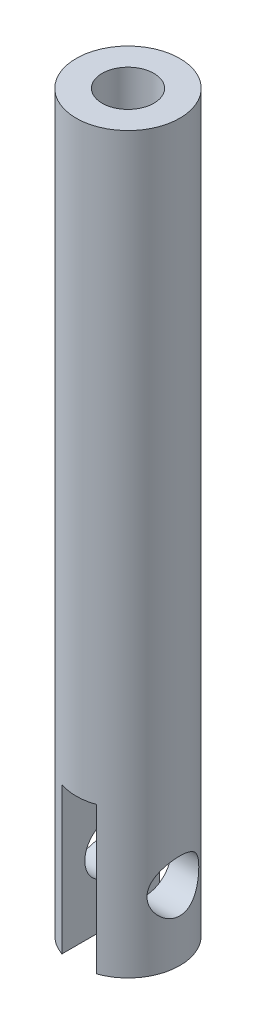
ISO-10303-21;
HEADER;
FILE_DESCRIPTION(('STEP AP214'),'2;1');
FILE_NAME('part.step','',(''),(''),'','','');
FILE_SCHEMA(('AUTOMOTIVE_DESIGN { 1 0 10303 214 1 1 1 1 }'));
ENDSEC;
DATA;
#1=APPLICATION_CONTEXT('core data for automotive mechanical design processes');
#2=APPLICATION_PROTOCOL_DEFINITION('international standard','automotive_design',2000,#1);
#3=PRODUCT_CONTEXT('',#1,'mechanical');
#4=PRODUCT('Part','Part','',(#3));
#5=PRODUCT_RELATED_PRODUCT_CATEGORY('part','',(#4));
#6=PRODUCT_DEFINITION_FORMATION('','',#4);
#7=PRODUCT_DEFINITION_CONTEXT('part definition',#1,'design');
#8=PRODUCT_DEFINITION('design','',#6,#7);
#9=PRODUCT_DEFINITION_SHAPE('','',#8);
#10=(LENGTH_UNIT() NAMED_UNIT(*) SI_UNIT(.MILLI.,.METRE.));
#11=(NAMED_UNIT(*) PLANE_ANGLE_UNIT() SI_UNIT($,.RADIAN.));
#12=(NAMED_UNIT(*) SI_UNIT($,.STERADIAN.) SOLID_ANGLE_UNIT());
#13=UNCERTAINTY_MEASURE_WITH_UNIT(LENGTH_MEASURE(1.E-05),#10,'distance_accuracy_value','');
#14=(GEOMETRIC_REPRESENTATION_CONTEXT(3) GLOBAL_UNCERTAINTY_ASSIGNED_CONTEXT((#13)) GLOBAL_UNIT_ASSIGNED_CONTEXT((#10,
#11,#12)) REPRESENTATION_CONTEXT('',''));
#15=CARTESIAN_POINT('',(0.,0.,0.));
#16=DIRECTION('',(0.,0.,1.));
#17=DIRECTION('',(1.,0.,0.));
#18=AXIS2_PLACEMENT_3D('',#15,#16,#17);
#19=CARTESIAN_POINT('',(0.,75.,0.));
#20=DIRECTION('',(0.,-1.,0.));
#21=DIRECTION('',(0.,0.,-1.));
#22=AXIS2_PLACEMENT_3D('',#19,#20,#21);
#23=CYLINDRICAL_SURFACE('',#22,1.5);
#24=CARTESIAN_POINT('',(0.,7.00000000000001,0.));
#25=DIRECTION('',(0.,-1.,0.));
#26=DIRECTION('',(0.,0.,-1.));
#27=AXIS2_PLACEMENT_3D('',#24,#25,#26);
#28=CIRCLE('',#27,1.5);
#29=CARTESIAN_POINT('',(0.,7.00000000000001,-1.5));
#30=VERTEX_POINT('',#29);
#31=EDGE_CURVE('E180',#30,#30,#28,.T.);
#32=ORIENTED_EDGE('',*,*,#31,.T.);
#33=EDGE_LOOP('',(#32));
#34=FACE_BOUND('',#33,.T.);
#35=CARTESIAN_POINT('',(0.,54.,0.));
#36=DIRECTION('',(0.,-0.707106781186547,0.707106781186548));
#37=DIRECTION('',(0.,-0.707106781186547,-0.707106781186548));
#38=AXIS2_PLACEMENT_3D('',#35,#36,#37);
#39=ELLIPSE('',#38,2.12132034355964,1.5);
#40=CARTESIAN_POINT('',(-1.5,54.,0.));
#41=VERTEX_POINT('',#40);
#42=CARTESIAN_POINT('',(1.5,54.,0.));
#43=VERTEX_POINT('',#42);
#44=EDGE_CURVE('E79',#41,#43,#39,.T.);
#45=ORIENTED_EDGE('',*,*,#44,.F.);
#46=CARTESIAN_POINT('',(0.,54.,0.));
#47=DIRECTION('',(0.,-0.707106781186547,-0.707106781186548));
#48=DIRECTION('',(0.,-0.707106781186547,0.707106781186548));
#49=AXIS2_PLACEMENT_3D('',#46,#47,#48);
#50=ELLIPSE('',#49,2.12132034355964,1.5);
#51=EDGE_CURVE('E177',#43,#41,#50,.F.);
#52=ORIENTED_EDGE('',*,*,#51,.F.);
#53=EDGE_LOOP('',(#45,#52));
#54=FACE_BOUND('',#53,.T.);
#55=CARTESIAN_POINT('',(0.,23.5,0.));
#56=DIRECTION('',(0.,-0.707106781186547,0.707106781186548));
#57=DIRECTION('',(0.,-0.707106781186547,-0.707106781186548));
#58=AXIS2_PLACEMENT_3D('',#55,#56,#57);
#59=ELLIPSE('',#58,2.12132034355964,1.5);
#60=CARTESIAN_POINT('',(-1.5,23.5,0.));
#61=VERTEX_POINT('',#60);
#62=CARTESIAN_POINT('',(1.5,23.5,0.));
#63=VERTEX_POINT('',#62);
#64=EDGE_CURVE('E172',#61,#63,#59,.T.);
#65=ORIENTED_EDGE('',*,*,#64,.F.);
#66=CARTESIAN_POINT('',(0.,23.5,0.));
#67=DIRECTION('',(0.,-0.707106781186547,-0.707106781186548));
#68=DIRECTION('',(0.,-0.707106781186547,0.707106781186548));
#69=AXIS2_PLACEMENT_3D('',#66,#67,#68);
#70=ELLIPSE('',#69,2.12132034355964,1.5);
#71=EDGE_CURVE('E171',#63,#61,#70,.F.);
#72=ORIENTED_EDGE('',*,*,#71,.F.);
#73=EDGE_LOOP('',(#65,#72));
#74=FACE_BOUND('',#73,.T.);
#75=CARTESIAN_POINT('',(0.,61.,0.));
#76=DIRECTION('',(0.,1.,0.));
#77=DIRECTION('',(0.,0.,1.));
#78=AXIS2_PLACEMENT_3D('',#75,#76,#77);
#79=CIRCLE('',#78,1.5);
#80=CARTESIAN_POINT('',(0.,61.,1.5));
#81=VERTEX_POINT('',#80);
#82=EDGE_CURVE('E59',#81,#81,#79,.T.);
#83=ORIENTED_EDGE('',*,*,#82,.T.);
#84=EDGE_LOOP('',(#83));
#85=FACE_BOUND('',#84,.T.);
#86=ADVANCED_FACE('F54',(#34,#54,#74,#85),#23,.F.);
#87=CARTESIAN_POINT('',(0.,75.,0.));
#88=DIRECTION('',(0.,-1.,0.));
#89=DIRECTION('',(0.,0.,-1.));
#90=AXIS2_PLACEMENT_3D('',#87,#88,#89);
#91=CYLINDRICAL_SURFACE('',#90,6.);
#92=CARTESIAN_POINT('',(0.,-10.,0.));
#93=DIRECTION('',(0.,-1.,0.));
#94=DIRECTION('',(0.,0.,-1.));
#95=AXIS2_PLACEMENT_3D('',#92,#93,#94);
#96=CIRCLE('',#95,6.);
#97=CARTESIAN_POINT('',(-2.,-10.,5.65685424949238));
#98=VERTEX_POINT('',#97);
#99=CARTESIAN_POINT('',(-2.,-10.,-5.65685424949238));
#100=VERTEX_POINT('',#99);
#101=EDGE_CURVE('E126',#98,#100,#96,.T.);
#102=ORIENTED_EDGE('',*,*,#101,.F.);
#103=DIRECTION('',(0.,-1.,0.));
#104=VECTOR('',#103,1.);
#105=CARTESIAN_POINT('',(-2.,75.,5.65685424949238));
#106=LINE('',#105,#104);
#107=CARTESIAN_POINT('',(-2.,7.00000000000001,5.65685424949238));
#108=VERTEX_POINT('',#107);
#109=EDGE_CURVE('E122',#98,#108,#106,.F.);
#110=ORIENTED_EDGE('',*,*,#109,.T.);
#111=CARTESIAN_POINT('',(0.,7.00000000000001,0.));
#112=DIRECTION('',(0.,-1.,0.));
#113=DIRECTION('',(0.,0.,-1.));
#114=AXIS2_PLACEMENT_3D('',#111,#112,#113);
#115=CIRCLE('',#114,6.);
#116=CARTESIAN_POINT('',(2.,7.00000000000001,5.65685424949238));
#117=VERTEX_POINT('',#116);
#118=EDGE_CURVE('E121',#117,#108,#115,.T.);
#119=ORIENTED_EDGE('',*,*,#118,.F.);
#120=DIRECTION('',(0.,-1.,0.));
#121=VECTOR('',#120,1.);
#122=CARTESIAN_POINT('',(2.,75.,5.65685424949238));
#123=LINE('',#122,#121);
#124=CARTESIAN_POINT('',(2.,-10.,5.65685424949238));
#125=VERTEX_POINT('',#124);
#126=EDGE_CURVE('E109',#117,#125,#123,.T.);
#127=ORIENTED_EDGE('',*,*,#126,.T.);
#128=CARTESIAN_POINT('',(2.,-10.,-5.65685424949238));
#129=VERTEX_POINT('',#128);
#130=EDGE_CURVE('E119',#129,#125,#96,.T.);
#131=ORIENTED_EDGE('',*,*,#130,.F.);
#132=DIRECTION('',(0.,-1.,0.));
#133=VECTOR('',#132,1.);
#134=CARTESIAN_POINT('',(2.,75.,-5.65685424949238));
#135=LINE('',#134,#133);
#136=CARTESIAN_POINT('',(2.,7.00000000000001,-5.65685424949238));
#137=VERTEX_POINT('',#136);
#138=EDGE_CURVE('E72',#129,#137,#135,.F.);
#139=ORIENTED_EDGE('',*,*,#138,.T.);
#140=CARTESIAN_POINT('',(-2.,7.00000000000001,-5.65685424949238));
#141=VERTEX_POINT('',#140);
#142=EDGE_CURVE('E133',#141,#137,#115,.T.);
#143=ORIENTED_EDGE('',*,*,#142,.F.);
#144=DIRECTION('',(0.,-1.,0.));
#145=VECTOR('',#144,1.);
#146=CARTESIAN_POINT('',(-2.,75.,-5.65685424949238));
#147=LINE('',#146,#145);
#148=EDGE_CURVE('E182',#141,#100,#147,.T.);
#149=ORIENTED_EDGE('',*,*,#148,.T.);
#150=EDGE_LOOP('',(#102,#110,#119,#127,#131,#139,#143,#149));
#151=FACE_BOUND('',#150,.T.);
#152=CARTESIAN_POINT('',(0.,55.5,-6.));
#153=CARTESIAN_POINT('',(-0.0828760886697314,55.4999976742618,-5.99999859868013));
#154=CARTESIAN_POINT('',(-0.165778157830764,55.4931084492262,-5.99826578131828));
#155=CARTESIAN_POINT('',(-0.329206323770533,55.465774848693,-5.99152113829892));
#156=CARTESIAN_POINT('',(-0.40973104687074,55.4453227904621,-5.98650745419969));
#157=CARTESIAN_POINT('',(-0.56602087218258,55.3915607465379,-5.9737562633204));
#158=CARTESIAN_POINT('',(-0.641791563430007,55.3582662012847,-5.96602202842087));
#159=CARTESIAN_POINT('',(-0.78667213190443,55.2798186099552,-5.94865343807593));
#160=CARTESIAN_POINT('',(-0.855781784348762,55.2346651638811,-5.93901901854051));
#161=CARTESIAN_POINT('',(-0.986801927300921,55.1327992103458,-5.91867413591801));
#162=CARTESIAN_POINT('',(-1.04855569006107,55.0758884250408,-5.90794707148533));
#163=CARTESIAN_POINT('',(-1.1617489272033,54.9525477950911,-5.8867362011753));
#164=CARTESIAN_POINT('',(-1.21318723694913,54.8861168770535,-5.87625242288349));
#165=CARTESIAN_POINT('',(-1.30502654279903,54.7444047732626,-5.85654775699711));
#166=CARTESIAN_POINT('',(-1.34525221592536,54.6690067691896,-5.84734794470605));
#167=CARTESIAN_POINT('',(-1.41239690855053,54.5122515883416,-5.83149494812223));
#168=CARTESIAN_POINT('',(-1.43931805543933,54.4308953666742,-5.82484135672789));
#169=CARTESIAN_POINT('',(-1.47855483680429,54.2662565017975,-5.81500476717551));
#170=CARTESIAN_POINT('',(-1.49115226833334,54.1830451039502,-5.81175491075426));
#171=CARTESIAN_POINT('',(-1.50226177506785,54.015631430986,-5.80889362537741));
#172=CARTESIAN_POINT('',(-1.50077614181798,53.9314293193014,-5.80928160448644));
#173=CARTESIAN_POINT('',(-1.48398652463928,53.7665841922555,-5.81359205496618));
#174=CARTESIAN_POINT('',(-1.46901834019052,53.6859043785349,-5.81742863001879));
#175=CARTESIAN_POINT('',(-1.42622418690311,53.5282389490887,-5.82806709676484));
#176=CARTESIAN_POINT('',(-1.39839730206943,53.451253596971,-5.83486919970697));
#177=CARTESIAN_POINT('',(-1.33038947793716,53.3022619837479,-5.85075113904187));
#178=CARTESIAN_POINT('',(-1.29008666723291,53.2303138282105,-5.85985327469421));
#179=CARTESIAN_POINT('',(-1.19835627601495,53.0940812902432,-5.87929710846386));
#180=CARTESIAN_POINT('',(-1.14692674880884,53.0297982519327,-5.88963902334736));
#181=CARTESIAN_POINT('',(-1.03266342468122,52.9087963843056,-5.91075880539781));
#182=CARTESIAN_POINT('',(-0.969546258165858,52.8523455099387,-5.92154069477971));
#183=CARTESIAN_POINT('',(-0.8346119175037,52.7507787575361,-5.94205965578786));
#184=CARTESIAN_POINT('',(-0.762794477707945,52.7056632257364,-5.95179669549416));
#185=CARTESIAN_POINT('',(-0.612115888681392,52.6279494137756,-5.96917732094183));
#186=CARTESIAN_POINT('',(-0.533231393208622,52.5953946597456,-5.97681360127725));
#187=CARTESIAN_POINT('',(-0.370876008142879,52.5440826942904,-5.98907916991419));
#188=CARTESIAN_POINT('',(-0.287405999150481,52.5253228435819,-5.99370903339281));
#189=CARTESIAN_POINT('',(-0.120539970390023,52.5025424344412,-5.99935499271375));
#190=CARTESIAN_POINT('',(-0.0371967199882068,52.4981569739247,-6.00046053508279));
#191=CARTESIAN_POINT('',(0.12903287480151,52.5032490020555,-5.99918804814451));
#192=CARTESIAN_POINT('',(0.211919259644597,52.5127252427991,-5.99681033241847));
#193=CARTESIAN_POINT('',(0.373614268776493,52.5449709083914,-5.98889581127357));
#194=CARTESIAN_POINT('',(0.452465118968755,52.567541263477,-5.98340634185811));
#195=CARTESIAN_POINT('',(0.605257292452513,52.6251070840284,-5.96988706634134));
#196=CARTESIAN_POINT('',(0.679198119032637,52.6601038043132,-5.96185700369892));
#197=CARTESIAN_POINT('',(0.821523134429848,52.7422361288747,-5.94393307926311));
#198=CARTESIAN_POINT('',(0.889785441835829,52.7895761123968,-5.93400867366932));
#199=CARTESIAN_POINT('',(1.01752661364324,52.894789908797,-5.91344509187419));
#200=CARTESIAN_POINT('',(1.07700395897301,52.9526655396169,-5.90280579251705));
#201=CARTESIAN_POINT('',(1.18699056807273,53.0790019608445,-5.88168956960771));
#202=CARTESIAN_POINT('',(1.23724386762204,53.1476877030024,-5.87122304187281));
#203=CARTESIAN_POINT('',(1.3255107590127,53.2927326344657,-5.85192878377239));
#204=CARTESIAN_POINT('',(1.36352489415794,53.3690914829598,-5.84310098067026));
#205=CARTESIAN_POINT('',(1.42595142060929,53.5269057224131,-5.82818094734665));
#206=CARTESIAN_POINT('',(1.45044439665407,53.608327628344,-5.82207255291906));
#207=CARTESIAN_POINT('',(1.48534565995378,53.7743096378891,-5.81326744090184));
#208=CARTESIAN_POINT('',(1.49575702747866,53.8588690510325,-5.81056997719936));
#209=CARTESIAN_POINT('',(1.502038590334,54.0261210238552,-5.80894901203957));
#210=CARTESIAN_POINT('',(1.49831789778012,54.1087974351247,-5.80991932728264));
#211=CARTESIAN_POINT('',(1.47737727831287,54.272303888668,-5.81527909007843));
#212=CARTESIAN_POINT('',(1.46015762268677,54.3531339680136,-5.81966846891857));
#213=CARTESIAN_POINT('',(1.4129313194428,54.5102084590654,-5.83131260682723));
#214=CARTESIAN_POINT('',(1.38300140468038,54.5864773052402,-5.83855015236309));
#215=CARTESIAN_POINT('',(1.31126491360507,54.7329653827137,-5.85507755724829));
#216=CARTESIAN_POINT('',(1.26945669003419,54.8031837731869,-5.86436770120773));
#217=CARTESIAN_POINT('',(1.17386774863714,54.937554629002,-5.88425634263512));
#218=CARTESIAN_POINT('',(1.11980316291226,55.001501073424,-5.89488264831757));
#219=CARTESIAN_POINT('',(1.00178937118973,55.1195470447954,-5.91608027246286));
#220=CARTESIAN_POINT('',(0.937837821261141,55.173644230113,-5.9266515772706));
#221=CARTESIAN_POINT('',(0.800467586702585,55.2714113085646,-5.94677655647663));
#222=CARTESIAN_POINT('',(0.726898422316384,55.3148746136716,-5.95630833365868));
#223=CARTESIAN_POINT('',(0.573266059510476,55.3887474629405,-5.97304924975118));
#224=CARTESIAN_POINT('',(0.49320756343674,55.4191663606485,-5.98026005199782));
#225=CARTESIAN_POINT('',(0.344410253243473,55.4615718303297,-5.99048059565542));
#226=CARTESIAN_POINT('',(0.276380170908069,55.4759512430534,-5.99402585052691));
#227=CARTESIAN_POINT('',(0.138906071536284,55.4951659436219,-5.99878605231948));
#228=CARTESIAN_POINT('',(0.0694621612426165,55.5000019493053,-6.00000117450894));
#229=CARTESIAN_POINT('',(0.,55.5,-6.));
#230=B_SPLINE_CURVE_WITH_KNOTS('',3,(#152,#153,#154,#155,#156,#157,#158,#159,#160,#161,#162,
#163,#164,#165,#166,#167,#168,#169,#170,#171,#172,#173,#174,#175,#176,#177,#178,#179,#180,#181,
#182,#183,#184,#185,#186,#187,#188,#189,#190,#191,#192,#193,#194,#195,#196,#197,#198,#199,#200,
#201,#202,#203,#204,#205,#206,#207,#208,#209,#210,#211,#212,#213,#214,#215,#216,#217,#218,#219,
#220,#221,#222,#223,#224,#225,#226,#227,#228,#229),.UNSPECIFIED.,.T.,.F.,(4,2,2,2,2,2,2,2,2,2,2,
2,2,2,2,2,2,2,2,2,2,2,2,2,2,2,2,2,2,2,2,2,2,2,2,2,2,2,4),(0.,0.248373712471891,0.4968882377639,
0.745104902286113,0.993329940169332,1.24614435437139,1.49898729580062,1.75558647545807,
2.01214461169369,2.2635629509943,2.51494038112697,2.76022497007017,3.00552703466038,
3.25330527873879,3.50112690836163,3.7560150096902,4.01091089558247,4.26668229009115,
4.52240473688644,4.77158308949277,5.02073901112743,5.26620274514038,5.51169127322291,
5.76153587565352,6.01142363008019,6.26744509204478,6.52345518749509,6.77792254614037,
7.03233423252408,7.27943780398612,7.52653640956034,7.77216400559447,8.01782568136901,
8.26989576409911,8.52202569770418,8.77872185499589,9.0352336382135,9.2434224294215,
9.4515955604304),.UNSPECIFIED.);
#231=CARTESIAN_POINT('',(0.,55.5,-6.));
#232=VERTEX_POINT('',#231);
#233=EDGE_CURVE('E125',#232,#232,#230,.T.);
#234=ORIENTED_EDGE('',*,*,#233,.T.);
#235=EDGE_LOOP('',(#234));
#236=FACE_BOUND('',#235,.T.);
#237=CARTESIAN_POINT('',(0.,25.,-6.));
#238=CARTESIAN_POINT('',(-0.0828760886697305,24.9999976742619,-5.99999859868013));
#239=CARTESIAN_POINT('',(-0.165778157830762,24.9931084492262,-5.99826578131828));
#240=CARTESIAN_POINT('',(-0.329206323770532,24.965774848693,-5.99152113829892));
#241=CARTESIAN_POINT('',(-0.40973104687074,24.9453227904622,-5.98650745419969));
#242=CARTESIAN_POINT('',(-0.566020872182577,24.8915607465379,-5.9737562633204));
#243=CARTESIAN_POINT('',(-0.641791563430001,24.8582662012847,-5.96602202842087));
#244=CARTESIAN_POINT('',(-0.786672131904424,24.7798186099552,-5.94865343807593));
#245=CARTESIAN_POINT('',(-0.85578178434876,24.7346651638811,-5.93901901854051));
#246=CARTESIAN_POINT('',(-0.986801927300921,24.6327992103458,-5.91867413591802));
#247=CARTESIAN_POINT('',(-1.04855569006107,24.5758884250408,-5.90794707148533));
#248=CARTESIAN_POINT('',(-1.1617489272033,24.4525477950911,-5.8867362011753));
#249=CARTESIAN_POINT('',(-1.21318723694913,24.3861168770535,-5.87625242288349));
#250=CARTESIAN_POINT('',(-1.30502654279903,24.2444047732626,-5.85654775699711));
#251=CARTESIAN_POINT('',(-1.34525221592536,24.1690067691896,-5.84734794470605));
#252=CARTESIAN_POINT('',(-1.41239690855053,24.0122515883416,-5.83149494812223));
#253=CARTESIAN_POINT('',(-1.43931805543933,23.9308953666742,-5.82484135672789));
#254=CARTESIAN_POINT('',(-1.47855483680429,23.7662565017975,-5.81500476717551));
#255=CARTESIAN_POINT('',(-1.49115226833334,23.6830451039502,-5.81175491075426));
#256=CARTESIAN_POINT('',(-1.50226177506785,23.515631430986,-5.80889362537741));
#257=CARTESIAN_POINT('',(-1.50077614181798,23.4314293193014,-5.80928160448644));
#258=CARTESIAN_POINT('',(-1.48398652463928,23.2665841922555,-5.81359205496618));
#259=CARTESIAN_POINT('',(-1.46901834019052,23.1859043785349,-5.81742863001879));
#260=CARTESIAN_POINT('',(-1.42622418690311,23.0282389490887,-5.82806709676484));
#261=CARTESIAN_POINT('',(-1.39839730206942,22.951253596971,-5.83486919970697));
#262=CARTESIAN_POINT('',(-1.33038947793716,22.8022619837479,-5.85075113904187));
#263=CARTESIAN_POINT('',(-1.29008666723291,22.7303138282105,-5.85985327469421));
#264=CARTESIAN_POINT('',(-1.19835627601496,22.5940812902432,-5.87929710846386));
#265=CARTESIAN_POINT('',(-1.14692674880884,22.5297982519328,-5.88963902334735));
#266=CARTESIAN_POINT('',(-1.03266342468122,22.4087963843056,-5.91075880539781));
#267=CARTESIAN_POINT('',(-0.969546258165864,22.3523455099387,-5.92154069477971));
#268=CARTESIAN_POINT('',(-0.834611917503704,22.2507787575361,-5.94205965578786));
#269=CARTESIAN_POINT('',(-0.762794477707947,22.2056632257364,-5.95179669549416));
#270=CARTESIAN_POINT('',(-0.612115888681395,22.1279494137756,-5.96917732094183));
#271=CARTESIAN_POINT('',(-0.533231393208628,22.0953946597456,-5.97681360127725));
#272=CARTESIAN_POINT('',(-0.370876008142887,22.0440826942904,-5.98907916991419));
#273=CARTESIAN_POINT('',(-0.287405999150487,22.0253228435819,-5.99370903339281));
#274=CARTESIAN_POINT('',(-0.120539970390028,22.0025424344412,-5.99935499271375));
#275=CARTESIAN_POINT('',(-0.0371967199882107,21.9981569739247,-6.00046053508279));
#276=CARTESIAN_POINT('',(0.129032874801507,22.0032490020555,-5.99918804814451));
#277=CARTESIAN_POINT('',(0.211919259644594,22.0127252427991,-5.99681033241847));
#278=CARTESIAN_POINT('',(0.37361426877649,22.0449709083914,-5.98889581127357));
#279=CARTESIAN_POINT('',(0.452465118968753,22.067541263477,-5.98340634185811));
#280=CARTESIAN_POINT('',(0.60525729245251,22.1251070840285,-5.96988706634134));
#281=CARTESIAN_POINT('',(0.679198119032633,22.1601038043132,-5.96185700369892));
#282=CARTESIAN_POINT('',(0.821523134429848,22.2422361288747,-5.94393307926311));
#283=CARTESIAN_POINT('',(0.889785441835832,22.2895761123968,-5.93400867366932));
#284=CARTESIAN_POINT('',(1.01752661364325,22.394789908797,-5.91344509187419));
#285=CARTESIAN_POINT('',(1.07700395897301,22.4526655396169,-5.90280579251705));
#286=CARTESIAN_POINT('',(1.18699056807273,22.5790019608445,-5.88168956960771));
#287=CARTESIAN_POINT('',(1.23724386762203,22.6476877030024,-5.87122304187281));
#288=CARTESIAN_POINT('',(1.3255107590127,22.7927326344657,-5.85192878377239));
#289=CARTESIAN_POINT('',(1.36352489415794,22.8690914829598,-5.84310098067026));
#290=CARTESIAN_POINT('',(1.42595142060929,23.0269057224131,-5.82818094734665));
#291=CARTESIAN_POINT('',(1.45044439665407,23.108327628344,-5.82207255291905));
#292=CARTESIAN_POINT('',(1.48534565995378,23.2743096378891,-5.81326744090183));
#293=CARTESIAN_POINT('',(1.49575702747866,23.3588690510325,-5.81056997719936));
#294=CARTESIAN_POINT('',(1.502038590334,23.5261210238552,-5.80894901203957));
#295=CARTESIAN_POINT('',(1.49831789778012,23.6087974351247,-5.80991932728264));
#296=CARTESIAN_POINT('',(1.47737727831287,23.772303888668,-5.81527909007843));
#297=CARTESIAN_POINT('',(1.46015762268677,23.8531339680137,-5.81966846891857));
#298=CARTESIAN_POINT('',(1.4129313194428,24.0102084590654,-5.83131260682723));
#299=CARTESIAN_POINT('',(1.38300140468038,24.0864773052402,-5.8385501523631));
#300=CARTESIAN_POINT('',(1.31126491360507,24.2329653827137,-5.85507755724829));
#301=CARTESIAN_POINT('',(1.26945669003419,24.3031837731869,-5.86436770120773));
#302=CARTESIAN_POINT('',(1.17386774863714,24.437554629002,-5.88425634263512));
#303=CARTESIAN_POINT('',(1.11980316291225,24.501501073424,-5.89488264831757));
#304=CARTESIAN_POINT('',(1.00178937118974,24.6195470447954,-5.91608027246286));
#305=CARTESIAN_POINT('',(0.937837821261147,24.673644230113,-5.9266515772706));
#306=CARTESIAN_POINT('',(0.800467586702592,24.7714113085646,-5.94677655647663));
#307=CARTESIAN_POINT('',(0.726898422316388,24.8148746136716,-5.95630833365868));
#308=CARTESIAN_POINT('',(0.573266059510478,24.8887474629405,-5.97304924975118));
#309=CARTESIAN_POINT('',(0.493207563436743,24.9191663606485,-5.98026005199782));
#310=CARTESIAN_POINT('',(0.344410253243475,24.9615718303297,-5.99048059565542));
#311=CARTESIAN_POINT('',(0.276380170908071,24.9759512430534,-5.99402585052691));
#312=CARTESIAN_POINT('',(0.138906071536284,24.9951659436219,-5.99878605231948));
#313=CARTESIAN_POINT('',(0.0694621612426167,25.0000019493053,-6.00000117450894));
#314=CARTESIAN_POINT('',(0.,25.,-6.));
#315=B_SPLINE_CURVE_WITH_KNOTS('',3,(#237,#238,#239,#240,#241,#242,#243,#244,#245,#246,#247,
#248,#249,#250,#251,#252,#253,#254,#255,#256,#257,#258,#259,#260,#261,#262,#263,#264,#265,#266,
#267,#268,#269,#270,#271,#272,#273,#274,#275,#276,#277,#278,#279,#280,#281,#282,#283,#284,#285,
#286,#287,#288,#289,#290,#291,#292,#293,#294,#295,#296,#297,#298,#299,#300,#301,#302,#303,#304,
#305,#306,#307,#308,#309,#310,#311,#312,#313,#314),.UNSPECIFIED.,.T.,.F.,(4,2,2,2,2,2,2,2,2,2,2,
2,2,2,2,2,2,2,2,2,2,2,2,2,2,2,2,2,2,2,2,2,2,2,2,2,2,2,4),(0.,0.248373712471888,
0.496888237763897,0.745104902286106,0.993329940169327,1.24614435437139,1.49898729580062,
1.75558647545807,2.01214461169368,2.2635629509943,2.51494038112697,2.76022497007018,
3.00552703466038,3.25330527873879,3.50112690836162,3.75601500969019,4.01091089558247,
4.26668229009114,4.52240473688643,4.77158308949276,5.02073901112743,5.26620274514037,
5.5116912732229,5.76153587565352,6.01142363008019,6.26744509204476,6.52345518749508,
6.77792254614036,7.03233423252408,7.27943780398613,7.52653640956034,7.77216400559447,
8.01782568136901,8.2698957640991,8.52202569770418,8.77872185499588,9.0352336382135,
9.24342242942149,9.4515955604304),.UNSPECIFIED.);
#316=CARTESIAN_POINT('',(0.,25.,-6.));
#317=VERTEX_POINT('',#316);
#318=EDGE_CURVE('E129',#317,#317,#315,.T.);
#319=ORIENTED_EDGE('',*,*,#318,.T.);
#320=EDGE_LOOP('',(#319));
#321=FACE_BOUND('',#320,.T.);
#322=CARTESIAN_POINT('',(0.,75.,0.));
#323=DIRECTION('',(0.,1.,0.));
#324=DIRECTION('',(0.,0.,1.));
#325=AXIS2_PLACEMENT_3D('',#322,#323,#324);
#326=CIRCLE('',#325,6.);
#327=CARTESIAN_POINT('',(0.,75.,6.));
#328=VERTEX_POINT('',#327);
#329=EDGE_CURVE('E169',#328,#328,#326,.T.);
#330=ORIENTED_EDGE('',*,*,#329,.F.);
#331=EDGE_LOOP('',(#330));
#332=FACE_BOUND('',#331,.T.);
#333=CARTESIAN_POINT('',(-5.19615242270664,-2.,3.));
#334=CARTESIAN_POINT('',(-5.19615338151414,-1.9217997667409,2.99999910875738));
#335=CARTESIAN_POINT('',(-5.19792581191127,-1.84359000153543,2.99693611207795));
#336=CARTESIAN_POINT('',(-5.20493931657123,-1.68779192485795,2.98473565374509));
#337=CARTESIAN_POINT('',(-5.21018200566082,-1.6102039197315,2.97559536411629));
#338=CARTESIAN_POINT('',(-5.23088200558207,-1.37905598575357,2.9391691225804));
#339=CARTESIAN_POINT('',(-5.25131076607215,-1.22724908946674,2.902878058149));
#340=CARTESIAN_POINT('',(-5.3024774692754,-0.933608366476454,2.80829998089523));
#341=CARTESIAN_POINT('',(-5.33316051577918,-0.791726198249104,2.75012989346617));
#342=CARTESIAN_POINT('',(-5.40128072966972,-0.519737238299182,2.61380253964662));
#343=CARTESIAN_POINT('',(-5.43871826241347,-0.389631084125081,2.53564419197538));
#344=CARTESIAN_POINT('',(-5.51990583559838,-0.133079853852275,2.35399963256537));
#345=CARTESIAN_POINT('',(-5.56392184571631,-0.00782179784407335,2.24895611137364));
#346=CARTESIAN_POINT('',(-5.651159547025,0.224224369689546,2.01976141989962));
#347=CARTESIAN_POINT('',(-5.69438083245621,0.331003268256697,1.89560077655245));
#348=CARTESIAN_POINT('',(-5.77864428988888,0.530101687732335,1.62146869109162));
#349=CARTESIAN_POINT('',(-5.81934318752246,0.620961365927233,1.47032156718994));
#350=CARTESIAN_POINT('',(-5.89052268800541,0.775422497428077,1.15247107964639));
#351=CARTESIAN_POINT('',(-5.92100973690811,0.839041153246576,0.985777614653092));
#352=CARTESIAN_POINT('',(-5.96641383603059,0.932513997989174,0.654134831556285));
#353=CARTESIAN_POINT('',(-5.98228440595573,0.964448579648055,0.489905370480168));
#354=CARTESIAN_POINT('',(-6.00022751605263,1.00049835544401,0.157711887079232));
#355=CARTESIAN_POINT('',(-6.00230840492439,1.00463038213226,-0.0102498138110368));
#356=CARTESIAN_POINT('',(-5.9928894562274,0.985759967365192,-0.329497576667919));
#357=CARTESIAN_POINT('',(-5.98255487247965,0.965085911921955,-0.480963609704589));
#358=CARTESIAN_POINT('',(-5.9512273620779,0.901357509803513,-0.77794130357984));
#359=CARTESIAN_POINT('',(-5.93023363786808,0.858301488422119,-0.923452517976629));
#360=CARTESIAN_POINT('',(-5.87914748253372,0.750752144230426,-1.20692822064062));
#361=CARTESIAN_POINT('',(-5.8489331854518,0.685970468799356,-1.34476044303001));
#362=CARTESIAN_POINT('',(-5.78212944004645,0.537210343292052,-1.60793023199368));
#363=CARTESIAN_POINT('',(-5.74553771044373,0.453225020490338,-1.73326330217191));
#364=CARTESIAN_POINT('',(-5.66533158492102,0.259311526060463,-1.98052168794677));
#365=CARTESIAN_POINT('',(-5.62138031742825,0.147681489358349,-2.10100497271934));
#366=CARTESIAN_POINT('',(-5.53363118085844,-0.0937597419088614,-2.32231036115798));
#367=CARTESIAN_POINT('',(-5.48983345502613,-0.223584793895677,-2.42311733790258));
#368=CARTESIAN_POINT('',(-5.40432084665525,-0.50798214334072,-2.6085269546345));
#369=CARTESIAN_POINT('',(-5.36291485750667,-0.663602435645985,-2.691694028528));
#370=CARTESIAN_POINT('',(-5.30915194408667,-0.907563054611753,-2.79542837524198));
#371=CARTESIAN_POINT('',(-5.2926194649543,-0.990656310404766,-2.82650797342001));
#372=CARTESIAN_POINT('',(-5.26298473463269,-1.15980860303443,-2.88131297532033));
#373=CARTESIAN_POINT('',(-5.24988036897854,-1.24586577447479,-2.90504291399185));
#374=CARTESIAN_POINT('',(-5.22855455988393,-1.41337162022403,-2.94323927983804));
#375=CARTESIAN_POINT('',(-5.22002982263214,-1.49464942563784,-2.95828810706486));
#376=CARTESIAN_POINT('',(-5.20672737157291,-1.6584352386659,-2.98163903200842));
#377=CARTESIAN_POINT('',(-5.20194770920409,-1.74094258374832,-2.98994463830254));
#378=CARTESIAN_POINT('',(-5.19633662863608,-1.90647100680271,-2.99968663811345));
#379=CARTESIAN_POINT('',(-5.19550374026212,-1.9894918819437,-3.00112558946313));
#380=CARTESIAN_POINT('',(-5.19780953199967,-2.15528646076465,-2.99712742537402));
#381=CARTESIAN_POINT('',(-5.20094794403249,-2.23806018075052,-2.99169077406597));
#382=CARTESIAN_POINT('',(-5.21504493010248,-2.46685913604269,-2.96710135231213));
#383=CARTESIAN_POINT('',(-5.23019160660498,-2.61191081026327,-2.9405616310018));
#384=CARTESIAN_POINT('',(-5.27081666384497,-2.89513091079687,-2.86709067362229));
#385=CARTESIAN_POINT('',(-5.29629839028765,-3.03329709183022,-2.82015283383764));
#386=CARTESIAN_POINT('',(-5.35608780273032,-3.30622610391993,-2.70494224478443));
#387=CARTESIAN_POINT('',(-5.39074960412731,-3.4405349279041,-2.63578205088436));
#388=CARTESIAN_POINT('',(-5.46468327792416,-3.69640993836604,-2.47886133231338));
#389=CARTESIAN_POINT('',(-5.50395751387985,-3.81796953081147,-2.39109125263821));
#390=CARTESIAN_POINT('',(-5.58864005140302,-4.06093562663187,-2.18651145695799));
#391=CARTESIAN_POINT('',(-5.63419752084738,-4.18039127090002,-2.067435804994));
#392=CARTESIAN_POINT('',(-5.72202702310923,-4.39823689529484,-1.81021349814979));
#393=CARTESIAN_POINT('',(-5.76429794308225,-4.4966197596755,-1.67206042712515));
#394=CARTESIAN_POINT('',(-5.84224085806642,-4.67172112757365,-1.37560608443379));
#395=CARTESIAN_POINT('',(-5.87770925226883,-4.74779934188309,-1.21686929217555));
#396=CARTESIAN_POINT('',(-5.93650064667294,-4.8714137243106,-0.88656709446955));
#397=CARTESIAN_POINT('',(-5.95983430919533,-4.91897495484196,-0.715013103124008));
#398=CARTESIAN_POINT('',(-5.9900252464518,-4.98010569184912,-0.380939047947199));
#399=CARTESIAN_POINT('',(-5.99819783930701,-4.99639363556079,-0.219034335650393));
#400=CARTESIAN_POINT('',(-6.00126390919338,-5.00252978843353,0.105377961951198));
#401=CARTESIAN_POINT('',(-5.99616203476054,-4.99238725318317,0.26788531631746));
#402=CARTESIAN_POINT('',(-5.97401907190636,-4.94775080986649,0.577613962536141));
#403=CARTESIAN_POINT('',(-5.95778686442443,-4.91490556233434,0.725136901247724));
#404=CARTESIAN_POINT('',(-5.91576278551446,-4.82801889196795,1.01233790874441));
#405=CARTESIAN_POINT('',(-5.88996954319457,-4.77397442945753,1.15201484923628));
#406=CARTESIAN_POINT('',(-5.829778017116,-4.64381927131126,1.42627001605164));
#407=CARTESIAN_POINT('',(-5.79505887623287,-4.56686365846372,1.56037465678411));
#408=CARTESIAN_POINT('',(-5.7206436338201,-4.39412457858644,1.81432469711303));
#409=CARTESIAN_POINT('',(-5.68094524943991,-4.29833246401126,1.93416350676913));
#410=CARTESIAN_POINT('',(-5.5958597881944,-4.07961527751646,2.16873884087782));
#411=CARTESIAN_POINT('',(-5.55029975504518,-3.9549386792264,2.28178066887875));
#412=CARTESIAN_POINT('',(-5.46188649509677,-3.68762167192986,2.48600225783028));
#413=CARTESIAN_POINT('',(-5.41903568750872,-3.54496553896892,2.57716267726706));
#414=CARTESIAN_POINT('',(-5.36004774906988,-3.31746820669823,2.6966555934249));
#415=CARTESIAN_POINT('',(-5.34101219148464,-3.23802419901758,2.73405408762355));
#416=CARTESIAN_POINT('',(-5.30572783063718,-3.07564671699129,2.80191257626505));
#417=CARTESIAN_POINT('',(-5.28947759301443,-2.992715066252,2.83237614466584));
#418=CARTESIAN_POINT('',(-5.26045215868186,-2.82415526763025,2.88592624586958));
#419=CARTESIAN_POINT('',(-5.24766803509091,-2.73853469275864,2.90903175649394));
#420=CARTESIAN_POINT('',(-5.22608869625113,-2.56514474468574,2.9476242805163));
#421=CARTESIAN_POINT('',(-5.21729069243666,-2.47737691907938,2.96311662049621));
#422=CARTESIAN_POINT('',(-5.20588528016134,-2.32460118224006,2.98309381225721));
#423=CARTESIAN_POINT('',(-5.20224442588138,-2.25990519109301,2.9894274622838));
#424=CARTESIAN_POINT('',(-5.19737751744686,-2.13014168320032,2.99788106792142));
#425=CARTESIAN_POINT('',(-5.1961516248372,-2.0650741418924,3.00000074164547));
#426=CARTESIAN_POINT('',(-5.19615242270664,-2.,3.));
#427=B_SPLINE_CURVE_WITH_KNOTS('',3,(#333,#334,#335,#336,#337,#338,#339,#340,#341,#342,#343,
#344,#345,#346,#347,#348,#349,#350,#351,#352,#353,#354,#355,#356,#357,#358,#359,#360,#361,#362,
#363,#364,#365,#366,#367,#368,#369,#370,#371,#372,#373,#374,#375,#376,#377,#378,#379,#380,#381,
#382,#383,#384,#385,#386,#387,#388,#389,#390,#391,#392,#393,#394,#395,#396,#397,#398,#399,#400,
#401,#402,#403,#404,#405,#406,#407,#408,#409,#410,#411,#412,#413,#414,#415,#416,#417,#418,#419,
#420,#421,#422,#423,#424,#425,#426),.UNSPECIFIED.,.T.,.F.,(4,2,2,2,2,2,2,2,2,2,2,2,2,2,2,2,2,2,
2,2,2,2,2,2,2,2,2,2,2,2,2,2,2,2,2,2,2,2,2,2,2,2,2,2,2,2,4),(0.,0.234529430733892,
0.469168072604264,0.938850383294531,1.40605749261242,1.87328988121657,2.37905864237582,
2.88507883741225,3.42520847204402,3.96499651379785,4.46637625391917,4.96745241546232,
5.42495462941727,5.88249108040477,6.34635774681552,6.81039068538928,7.31828744858784,
7.82657315225868,8.36713695676457,8.63752916119813,8.90775419202327,9.15669600787593,
9.40550821320573,9.65422772860786,9.90293045534219,10.3454331624118,10.7880792327729,
11.2512265518736,11.7146122462924,12.2364099671094,12.7583836090371,13.29413310208,
13.8294110539541,14.3155757713756,14.8015702635101,15.2555404058358,15.7095756650514,
16.1830301812752,16.6567025627126,17.177514915193,17.6987859450456,17.9680115893229,
18.2370981707631,18.5054849980179,18.7736837791728,18.9688338446807,19.1639969639894),.UNSPECIFIED.);
#428=CARTESIAN_POINT('',(-5.19615242270664,-2.,3.));
#429=VERTEX_POINT('',#428);
#430=EDGE_CURVE('E189',#429,#429,#427,.T.);
#431=ORIENTED_EDGE('',*,*,#430,.F.);
#432=EDGE_LOOP('',(#431));
#433=FACE_BOUND('',#432,.T.);
#434=CARTESIAN_POINT('',(5.19615242270663,-2.,3.));
#435=CARTESIAN_POINT('',(5.19615338151414,-2.0782002332591,2.99999910875738));
#436=CARTESIAN_POINT('',(5.19792581191127,-2.15640999846457,2.99693611207795));
#437=CARTESIAN_POINT('',(5.20493931657123,-2.31220807514206,2.98473565374509));
#438=CARTESIAN_POINT('',(5.21018200566082,-2.3897960802685,2.97559536411629));
#439=CARTESIAN_POINT('',(5.23088200558207,-2.62094401424643,2.9391691225804));
#440=CARTESIAN_POINT('',(5.25131076607215,-2.77275091053326,2.902878058149));
#441=CARTESIAN_POINT('',(5.3024774692754,-3.06639163352355,2.80829998089523));
#442=CARTESIAN_POINT('',(5.33316051577918,-3.2082738017509,2.75012989346617));
#443=CARTESIAN_POINT('',(5.40128072966972,-3.48026276170082,2.61380253964662));
#444=CARTESIAN_POINT('',(5.43871826241347,-3.61036891587492,2.53564419197538));
#445=CARTESIAN_POINT('',(5.51990583559838,-3.86692014614772,2.35399963256537));
#446=CARTESIAN_POINT('',(5.56392184571631,-3.99217820215593,2.24895611137364));
#447=CARTESIAN_POINT('',(5.651159547025,-4.22422436968955,2.01976141989962));
#448=CARTESIAN_POINT('',(5.69438083245621,-4.3310032682567,1.89560077655245));
#449=CARTESIAN_POINT('',(5.77864428988888,-4.53010168773234,1.62146869109162));
#450=CARTESIAN_POINT('',(5.81934318752246,-4.62096136592723,1.47032156718994));
#451=CARTESIAN_POINT('',(5.89052268800541,-4.77542249742808,1.15247107964639));
#452=CARTESIAN_POINT('',(5.92100973690811,-4.83904115324658,0.985777614653092));
#453=CARTESIAN_POINT('',(5.96641383603058,-4.93251399798917,0.654134831556285));
#454=CARTESIAN_POINT('',(5.98228440595573,-4.96444857964805,0.489905370480168));
#455=CARTESIAN_POINT('',(6.00022751605263,-5.00049835544401,0.157711887079232));
#456=CARTESIAN_POINT('',(6.00230840492439,-5.00463038213226,-0.0102498138110367));
#457=CARTESIAN_POINT('',(5.9928894562274,-4.98575996736519,-0.329497576667919));
#458=CARTESIAN_POINT('',(5.98255487247965,-4.96508591192195,-0.480963609704589));
#459=CARTESIAN_POINT('',(5.9512273620779,-4.90135750980351,-0.777941303579841));
#460=CARTESIAN_POINT('',(5.93023363786808,-4.85830148842212,-0.92345251797663));
#461=CARTESIAN_POINT('',(5.87914748253372,-4.75075214423043,-1.20692822064063));
#462=CARTESIAN_POINT('',(5.8489331854518,-4.68597046879936,-1.34476044303001));
#463=CARTESIAN_POINT('',(5.78212944004645,-4.53721034329205,-1.60793023199368));
#464=CARTESIAN_POINT('',(5.74553771044374,-4.45322502049034,-1.73326330217191));
#465=CARTESIAN_POINT('',(5.66533158492102,-4.25931152606046,-1.98052168794677));
#466=CARTESIAN_POINT('',(5.62138031742825,-4.14768148935835,-2.10100497271934));
#467=CARTESIAN_POINT('',(5.53363118085844,-3.90624025809114,-2.32231036115798));
#468=CARTESIAN_POINT('',(5.48983345502613,-3.77641520610432,-2.42311733790258));
#469=CARTESIAN_POINT('',(5.40432084665525,-3.49201785665928,-2.6085269546345));
#470=CARTESIAN_POINT('',(5.36291485750667,-3.33639756435402,-2.691694028528));
#471=CARTESIAN_POINT('',(5.30915194408667,-3.09243694538825,-2.79542837524198));
#472=CARTESIAN_POINT('',(5.2926194649543,-3.00934368959523,-2.82650797342001));
#473=CARTESIAN_POINT('',(5.2629847346327,-2.84019139696557,-2.88131297532033));
#474=CARTESIAN_POINT('',(5.24988036897854,-2.75413422552521,-2.90504291399185));
#475=CARTESIAN_POINT('',(5.22855455988393,-2.58662837977597,-2.94323927983804));
#476=CARTESIAN_POINT('',(5.22002982263214,-2.50535057436215,-2.95828810706486));
#477=CARTESIAN_POINT('',(5.20672737157291,-2.3415647613341,-2.98163903200842));
#478=CARTESIAN_POINT('',(5.20194770920409,-2.25905741625168,-2.98994463830254));
#479=CARTESIAN_POINT('',(5.19633662863608,-2.09352899319729,-2.99968663811345));
#480=CARTESIAN_POINT('',(5.19550374026212,-2.0105081180563,-3.00112558946313));
#481=CARTESIAN_POINT('',(5.19780953199967,-1.84471353923535,-2.99712742537402));
#482=CARTESIAN_POINT('',(5.20094794403249,-1.76193981924948,-2.99169077406597));
#483=CARTESIAN_POINT('',(5.21504493010248,-1.53314086395731,-2.96710135231213));
#484=CARTESIAN_POINT('',(5.23019160660498,-1.38808918973673,-2.9405616310018));
#485=CARTESIAN_POINT('',(5.27081666384497,-1.10486908920313,-2.86709067362229));
#486=CARTESIAN_POINT('',(5.29629839028765,-0.966702908169774,-2.82015283383764));
#487=CARTESIAN_POINT('',(5.35608780273032,-0.693773896080072,-2.70494224478443));
#488=CARTESIAN_POINT('',(5.39074960412731,-0.559465072095899,-2.63578205088436));
#489=CARTESIAN_POINT('',(5.46468327792416,-0.30359006163396,-2.47886133231338));
#490=CARTESIAN_POINT('',(5.50395751387985,-0.182030469188533,-2.39109125263821));
#491=CARTESIAN_POINT('',(5.58864005140302,0.0609356266318652,-2.18651145695799));
#492=CARTESIAN_POINT('',(5.63419752084738,0.180391270900021,-2.067435804994));
#493=CARTESIAN_POINT('',(5.72202702310923,0.398236895294838,-1.81021349814979));
#494=CARTESIAN_POINT('',(5.76429794308225,0.496619759675503,-1.67206042712515));
#495=CARTESIAN_POINT('',(5.84224085806642,0.671721127573647,-1.37560608443379));
#496=CARTESIAN_POINT('',(5.87770925226882,0.747799341883092,-1.21686929217555));
#497=CARTESIAN_POINT('',(5.93650064667294,0.871413724310594,-0.88656709446955));
#498=CARTESIAN_POINT('',(5.95983430919533,0.918974954841961,-0.715013103124009));
#499=CARTESIAN_POINT('',(5.9900252464518,0.980105691849116,-0.3809390479472));
#500=CARTESIAN_POINT('',(5.99819783930701,0.99639363556079,-0.219034335650393));
#501=CARTESIAN_POINT('',(6.00126390919338,1.00252978843353,0.105377961951197));
#502=CARTESIAN_POINT('',(5.99616203476054,0.992387253183167,0.267885316317458));
#503=CARTESIAN_POINT('',(5.97401907190636,0.947750809866495,0.577613962536139));
#504=CARTESIAN_POINT('',(5.95778686442443,0.914905562334337,0.725136901247722));
#505=CARTESIAN_POINT('',(5.91576278551446,0.828018891967945,1.01233790874441));
#506=CARTESIAN_POINT('',(5.88996954319457,0.773974429457525,1.15201484923628));
#507=CARTESIAN_POINT('',(5.829778017116,0.643819271311261,1.42627001605164));
#508=CARTESIAN_POINT('',(5.79505887623287,0.566863658463715,1.56037465678411));
#509=CARTESIAN_POINT('',(5.7206436338201,0.394124578586436,1.81432469711303));
#510=CARTESIAN_POINT('',(5.68094524943991,0.298332464011268,1.93416350676913));
#511=CARTESIAN_POINT('',(5.5958597881944,0.0796152775164602,2.16873884087782));
#512=CARTESIAN_POINT('',(5.55029975504518,-0.0450613207736009,2.28178066887875));
#513=CARTESIAN_POINT('',(5.46188649509677,-0.312378328070138,2.48600225783028));
#514=CARTESIAN_POINT('',(5.41903568750872,-0.455034461031079,2.57716267726705));
#515=CARTESIAN_POINT('',(5.36004774906988,-0.682531793301771,2.69665559342489));
#516=CARTESIAN_POINT('',(5.34101219148464,-0.761975800982417,2.73405408762355));
#517=CARTESIAN_POINT('',(5.30572783063718,-0.924353283008711,2.80191257626505));
#518=CARTESIAN_POINT('',(5.28947759301443,-1.007284933748,2.83237614466584));
#519=CARTESIAN_POINT('',(5.26045215868186,-1.17584473236975,2.88592624586958));
#520=CARTESIAN_POINT('',(5.24766803509091,-1.26146530724136,2.90903175649394));
#521=CARTESIAN_POINT('',(5.22608869625113,-1.43485525531426,2.9476242805163));
#522=CARTESIAN_POINT('',(5.21729069243665,-1.52262308092062,2.96311662049621));
#523=CARTESIAN_POINT('',(5.20588528016134,-1.67539881775994,2.98309381225721));
#524=CARTESIAN_POINT('',(5.20224442588138,-1.74009480890699,2.9894274622838));
#525=CARTESIAN_POINT('',(5.19737751744686,-1.86985831679968,2.99788106792142));
#526=CARTESIAN_POINT('',(5.1961516248372,-1.93492585810761,3.00000074164547));
#527=CARTESIAN_POINT('',(5.19615242270663,-2.,3.));
#528=B_SPLINE_CURVE_WITH_KNOTS('',3,(#434,#435,#436,#437,#438,#439,#440,#441,#442,#443,#444,
#445,#446,#447,#448,#449,#450,#451,#452,#453,#454,#455,#456,#457,#458,#459,#460,#461,#462,#463,
#464,#465,#466,#467,#468,#469,#470,#471,#472,#473,#474,#475,#476,#477,#478,#479,#480,#481,#482,
#483,#484,#485,#486,#487,#488,#489,#490,#491,#492,#493,#494,#495,#496,#497,#498,#499,#500,#501,
#502,#503,#504,#505,#506,#507,#508,#509,#510,#511,#512,#513,#514,#515,#516,#517,#518,#519,#520,
#521,#522,#523,#524,#525,#526,#527),.UNSPECIFIED.,.T.,.F.,(4,2,2,2,2,2,2,2,2,2,2,2,2,2,2,2,2,2,
2,2,2,2,2,2,2,2,2,2,2,2,2,2,2,2,2,2,2,2,2,2,2,2,2,2,2,2,4),(0.,0.234529430733892,
0.469168072604263,0.938850383294531,1.40605749261242,1.87328988121657,2.37905864237582,
2.88507883741225,3.42520847204402,3.96499651379785,4.46637625391917,4.96745241546232,
5.42495462941727,5.88249108040477,6.34635774681552,6.81039068538928,7.31828744858784,
7.82657315225867,8.36713695676457,8.63752916119813,8.90775419202327,9.15669600787593,
9.40550821320573,9.65422772860786,9.90293045534219,10.3454331624118,10.7880792327729,
11.2512265518736,11.7146122462924,12.2364099671094,12.7583836090371,13.29413310208,
13.8294110539541,14.3155757713756,14.8015702635101,15.2555404058358,15.7095756650514,
16.1830301812752,16.6567025627126,17.177514915193,17.6987859450456,17.968011589323,
18.2370981707631,18.5054849980179,18.7736837791728,18.9688338446807,19.1639969639894),.UNSPECIFIED.);
#529=CARTESIAN_POINT('',(5.19615242270663,-2.,3.));
#530=VERTEX_POINT('',#529);
#531=EDGE_CURVE('E206',#530,#530,#528,.T.);
#532=ORIENTED_EDGE('',*,*,#531,.F.);
#533=EDGE_LOOP('',(#532));
#534=FACE_BOUND('',#533,.T.);
#535=ADVANCED_FACE('F56',(#151,#236,#321,#332,#433,#534),#91,.T.);
#536=CARTESIAN_POINT('',(0.,-10.,0.));
#537=DIRECTION('',(0.,-1.,0.));
#538=DIRECTION('',(0.,0.,-1.));
#539=AXIS2_PLACEMENT_3D('',#536,#537,#538);
#540=PLANE('',#539);
#541=DIRECTION('',(0.,0.,-1.));
#542=VECTOR('',#541,1.);
#543=CARTESIAN_POINT('',(-2.,-10.,0.));
#544=LINE('',#543,#542);
#545=EDGE_CURVE('E14',#98,#100,#544,.T.);
#546=ORIENTED_EDGE('',*,*,#545,.F.);
#547=ORIENTED_EDGE('',*,*,#101,.T.);
#548=EDGE_LOOP('',(#546,#547));
#549=FACE_BOUND('',#548,.T.);
#550=ADVANCED_FACE('F157',(#549),#540,.T.);
#551=CARTESIAN_POINT('',(0.,75.,0.));
#552=DIRECTION('',(0.,1.,0.));
#553=DIRECTION('',(0.,0.,1.));
#554=AXIS2_PLACEMENT_3D('',#551,#552,#553);
#555=PLANE('',#554);
#556=CARTESIAN_POINT('',(0.,75.,0.));
#557=DIRECTION('',(0.,1.,0.));
#558=DIRECTION('',(0.,0.,1.));
#559=AXIS2_PLACEMENT_3D('',#556,#557,#558);
#560=CIRCLE('',#559,3.);
#561=CARTESIAN_POINT('',(0.,75.,3.));
#562=VERTEX_POINT('',#561);
#563=EDGE_CURVE('E166',#562,#562,#560,.T.);
#564=ORIENTED_EDGE('',*,*,#563,.F.);
#565=EDGE_LOOP('',(#564));
#566=FACE_BOUND('',#565,.T.);
#567=ORIENTED_EDGE('',*,*,#329,.T.);
#568=EDGE_LOOP('',(#567));
#569=FACE_BOUND('',#568,.T.);
#570=ADVANCED_FACE('F152',(#566,#569),#555,.T.);
#571=CARTESIAN_POINT('',(0.,23.5,-75.));
#572=DIRECTION('',(0.,0.,1.));
#573=DIRECTION('',(1.,0.,0.));
#574=AXIS2_PLACEMENT_3D('',#571,#572,#573);
#575=CYLINDRICAL_SURFACE('',#574,1.5);
#576=ORIENTED_EDGE('',*,*,#64,.T.);
#577=ORIENTED_EDGE('',*,*,#71,.T.);
#578=EDGE_LOOP('',(#576,#577));
#579=FACE_BOUND('',#578,.T.);
#580=ORIENTED_EDGE('',*,*,#318,.F.);
#581=EDGE_LOOP('',(#580));
#582=FACE_BOUND('',#581,.T.);
#583=ADVANCED_FACE('F147',(#579,#582),#575,.F.);
#584=CARTESIAN_POINT('',(0.,54.,-75.));
#585=DIRECTION('',(0.,0.,1.));
#586=DIRECTION('',(1.,0.,0.));
#587=AXIS2_PLACEMENT_3D('',#584,#585,#586);
#588=CYLINDRICAL_SURFACE('',#587,1.5);
#589=ORIENTED_EDGE('',*,*,#44,.T.);
#590=ORIENTED_EDGE('',*,*,#51,.T.);
#591=EDGE_LOOP('',(#589,#590));
#592=FACE_BOUND('',#591,.T.);
#593=ORIENTED_EDGE('',*,*,#233,.F.);
#594=EDGE_LOOP('',(#593));
#595=FACE_BOUND('',#594,.T.);
#596=ADVANCED_FACE('F143',(#592,#595),#588,.F.);
#597=DIRECTION('',(0.,0.,1.));
#598=VECTOR('',#597,1.);
#599=CARTESIAN_POINT('',(2.,-10.,0.));
#600=LINE('',#599,#598);
#601=EDGE_CURVE('E64',#129,#125,#600,.T.);
#602=ORIENTED_EDGE('',*,*,#601,.F.);
#603=ORIENTED_EDGE('',*,*,#130,.T.);
#604=EDGE_LOOP('',(#602,#603));
#605=FACE_BOUND('',#604,.T.);
#606=ADVANCED_FACE('F124',(#605),#540,.T.);
#607=CARTESIAN_POINT('',(0.,7.,0.));
#608=DIRECTION('',(0.,-1.,0.));
#609=DIRECTION('',(0.,0.,-1.));
#610=AXIS2_PLACEMENT_3D('',#607,#608,#609);
#611=PLANE('',#610);
#612=ORIENTED_EDGE('',*,*,#31,.F.);
#613=EDGE_LOOP('',(#612));
#614=FACE_BOUND('',#613,.T.);
#615=ORIENTED_EDGE('',*,*,#118,.T.);
#616=DIRECTION('',(0.,0.,-1.));
#617=VECTOR('',#616,1.);
#618=CARTESIAN_POINT('',(-2.,7.,-13.7728025257883));
#619=LINE('',#618,#617);
#620=EDGE_CURVE('E234',#108,#141,#619,.T.);
#621=ORIENTED_EDGE('',*,*,#620,.T.);
#622=ORIENTED_EDGE('',*,*,#142,.T.);
#623=DIRECTION('',(0.,0.,1.));
#624=VECTOR('',#623,1.);
#625=CARTESIAN_POINT('',(2.,7.,-13.7728025257883));
#626=LINE('',#625,#624);
#627=EDGE_CURVE('E239',#137,#117,#626,.T.);
#628=ORIENTED_EDGE('',*,*,#627,.T.);
#629=EDGE_LOOP('',(#615,#621,#622,#628));
#630=FACE_BOUND('',#629,.T.);
#631=ADVANCED_FACE('F218',(#614,#630),#611,.T.);
#632=CARTESIAN_POINT('',(-2.,7.,-13.7728025257883));
#633=DIRECTION('',(-1.,0.,0.));
#634=DIRECTION('',(0.,0.,1.));
#635=AXIS2_PLACEMENT_3D('',#632,#633,#634);
#636=PLANE('',#635);
#637=CARTESIAN_POINT('',(-2.,-2.,0.));
#638=DIRECTION('',(-1.,0.,0.));
#639=DIRECTION('',(0.,0.,1.));
#640=AXIS2_PLACEMENT_3D('',#637,#638,#639);
#641=CIRCLE('',#640,3.);
#642=CARTESIAN_POINT('',(-2.,-2.,3.));
#643=VERTEX_POINT('',#642);
#644=EDGE_CURVE('E185',#643,#643,#641,.F.);
#645=ORIENTED_EDGE('',*,*,#644,.F.);
#646=EDGE_LOOP('',(#645));
#647=FACE_BOUND('',#646,.T.);
#648=ORIENTED_EDGE('',*,*,#620,.F.);
#649=ORIENTED_EDGE('',*,*,#109,.F.);
#650=ORIENTED_EDGE('',*,*,#545,.T.);
#651=ORIENTED_EDGE('',*,*,#148,.F.);
#652=EDGE_LOOP('',(#648,#649,#650,#651));
#653=FACE_BOUND('',#652,.T.);
#654=ADVANCED_FACE('F222',(#647,#653),#636,.F.);
#655=CARTESIAN_POINT('',(2.,7.,-13.7728025257883));
#656=DIRECTION('',(1.,0.,0.));
#657=DIRECTION('',(0.,0.,-1.));
#658=AXIS2_PLACEMENT_3D('',#655,#656,#657);
#659=PLANE('',#658);
#660=CARTESIAN_POINT('',(2.,-2.,0.));
#661=DIRECTION('',(1.,0.,0.));
#662=DIRECTION('',(0.,0.,-1.));
#663=AXIS2_PLACEMENT_3D('',#660,#661,#662);
#664=CIRCLE('',#663,3.);
#665=CARTESIAN_POINT('',(2.,-2.,-3.));
#666=VERTEX_POINT('',#665);
#667=EDGE_CURVE('E183',#666,#666,#664,.F.);
#668=ORIENTED_EDGE('',*,*,#667,.F.);
#669=EDGE_LOOP('',(#668));
#670=FACE_BOUND('',#669,.T.);
#671=ORIENTED_EDGE('',*,*,#627,.F.);
#672=ORIENTED_EDGE('',*,*,#138,.F.);
#673=ORIENTED_EDGE('',*,*,#601,.T.);
#674=ORIENTED_EDGE('',*,*,#126,.F.);
#675=EDGE_LOOP('',(#671,#672,#673,#674));
#676=FACE_BOUND('',#675,.T.);
#677=ADVANCED_FACE('F108',(#670,#676),#659,.F.);
#678=CARTESIAN_POINT('',(13.,-2.,0.));
#679=DIRECTION('',(-1.,0.,0.));
#680=DIRECTION('',(0.,0.,1.));
#681=AXIS2_PLACEMENT_3D('',#678,#679,#680);
#682=CYLINDRICAL_SURFACE('',#681,3.);
#683=ORIENTED_EDGE('',*,*,#667,.T.);
#684=EDGE_LOOP('',(#683));
#685=FACE_BOUND('',#684,.T.);
#686=ORIENTED_EDGE('',*,*,#531,.T.);
#687=EDGE_LOOP('',(#686));
#688=FACE_BOUND('',#687,.T.);
#689=ADVANCED_FACE('F210',(#685,#688),#682,.F.);
#690=ORIENTED_EDGE('',*,*,#644,.T.);
#691=EDGE_LOOP('',(#690));
#692=FACE_BOUND('',#691,.T.);
#693=ORIENTED_EDGE('',*,*,#430,.T.);
#694=EDGE_LOOP('',(#693));
#695=FACE_BOUND('',#694,.T.);
#696=ADVANCED_FACE('F215',(#692,#695),#682,.F.);
#697=CARTESIAN_POINT('',(0.,61.,0.));
#698=DIRECTION('',(0.,1.,0.));
#699=DIRECTION('',(0.,0.,1.));
#700=AXIS2_PLACEMENT_3D('',#697,#698,#699);
#701=CYLINDRICAL_SURFACE('',#700,3.);
#702=CARTESIAN_POINT('',(0.,61.,0.));
#703=DIRECTION('',(0.,1.,0.));
#704=DIRECTION('',(0.,0.,1.));
#705=AXIS2_PLACEMENT_3D('',#702,#703,#704);
#706=CIRCLE('',#705,3.);
#707=CARTESIAN_POINT('',(0.,61.,3.));
#708=VERTEX_POINT('',#707);
#709=EDGE_CURVE('E192',#708,#708,#706,.T.);
#710=ORIENTED_EDGE('',*,*,#709,.F.);
#711=EDGE_LOOP('',(#710));
#712=FACE_BOUND('',#711,.T.);
#713=ORIENTED_EDGE('',*,*,#563,.T.);
#714=EDGE_LOOP('',(#713));
#715=FACE_BOUND('',#714,.T.);
#716=ADVANCED_FACE('F216',(#712,#715),#701,.F.);
#717=CARTESIAN_POINT('',(0.,61.,0.));
#718=DIRECTION('',(0.,1.,0.));
#719=DIRECTION('',(0.,0.,1.));
#720=AXIS2_PLACEMENT_3D('',#717,#718,#719);
#721=PLANE('',#720);
#722=ORIENTED_EDGE('',*,*,#82,.F.);
#723=EDGE_LOOP('',(#722));
#724=FACE_BOUND('',#723,.T.);
#725=ORIENTED_EDGE('',*,*,#709,.T.);
#726=EDGE_LOOP('',(#725));
#727=FACE_BOUND('',#726,.T.);
#728=ADVANCED_FACE('F291',(#724,#727),#721,.T.);
#729=CLOSED_SHELL('',(#86,#535,#550,#570,#583,#596,#606,#631,#654,#677,#689,#696,#716,#728));
#730=MANIFOLD_SOLID_BREP('B2',#729);
#731=ADVANCED_BREP_SHAPE_REPRESENTATION('',(#18,#730),#14);
#732=SHAPE_DEFINITION_REPRESENTATION(#9,#731);
ENDSEC;
END-ISO-10303-21;
